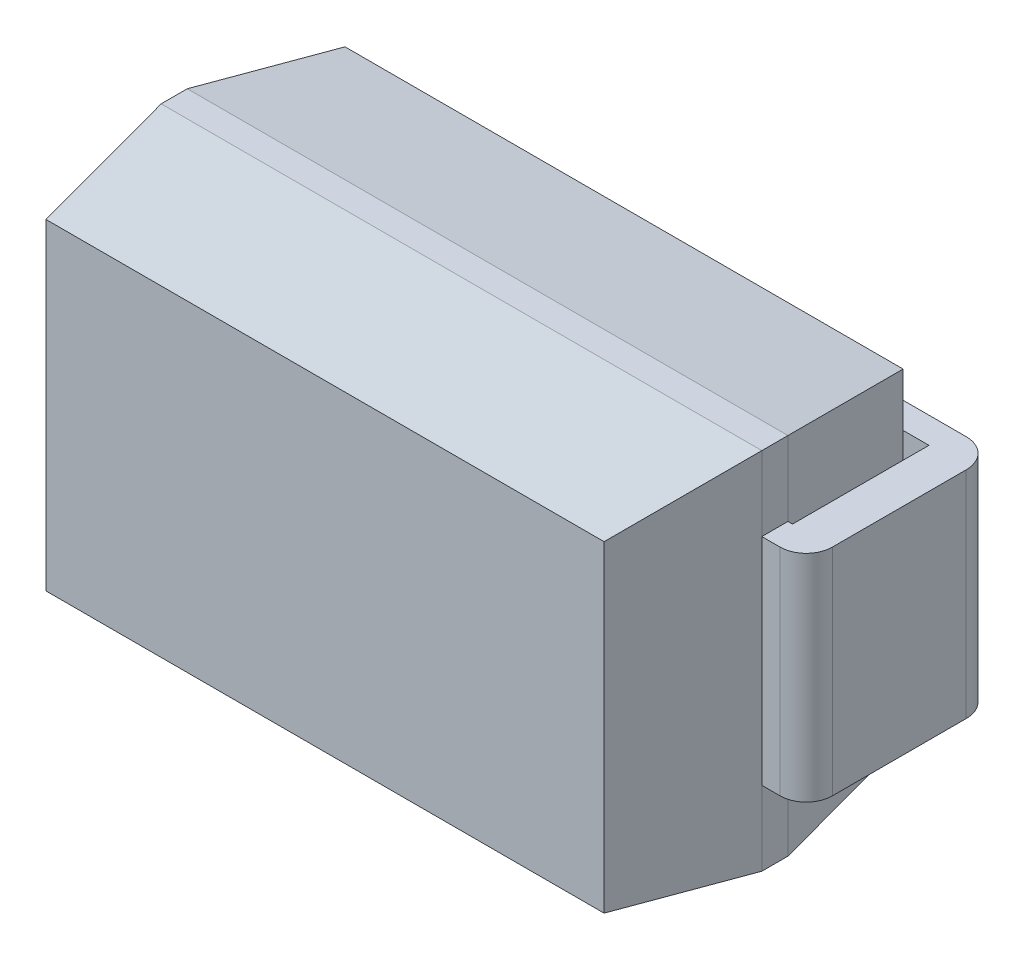
ISO-10303-21;
HEADER;
FILE_DESCRIPTION(('STEP AP214'),'2;1');
FILE_NAME('part.step','',(''),(''),'','','');
FILE_SCHEMA(('AUTOMOTIVE_DESIGN { 1 0 10303 214 1 1 1 1 }'));
ENDSEC;
DATA;
#1=APPLICATION_CONTEXT('core data for automotive mechanical design processes');
#2=APPLICATION_PROTOCOL_DEFINITION('international standard','automotive_design',2000,#1);
#3=PRODUCT_CONTEXT('',#1,'mechanical');
#4=PRODUCT('Part','Part','',(#3));
#5=PRODUCT_RELATED_PRODUCT_CATEGORY('part','',(#4));
#6=PRODUCT_DEFINITION_FORMATION('','',#4);
#7=PRODUCT_DEFINITION_CONTEXT('part definition',#1,'design');
#8=PRODUCT_DEFINITION('design','',#6,#7);
#9=PRODUCT_DEFINITION_SHAPE('','',#8);
#10=(LENGTH_UNIT() NAMED_UNIT(*) SI_UNIT(.MILLI.,.METRE.));
#11=(NAMED_UNIT(*) PLANE_ANGLE_UNIT() SI_UNIT($,.RADIAN.));
#12=(NAMED_UNIT(*) SI_UNIT($,.STERADIAN.) SOLID_ANGLE_UNIT());
#13=UNCERTAINTY_MEASURE_WITH_UNIT(LENGTH_MEASURE(1.E-05),#10,'distance_accuracy_value','');
#14=(GEOMETRIC_REPRESENTATION_CONTEXT(3) GLOBAL_UNCERTAINTY_ASSIGNED_CONTEXT((#13)) GLOBAL_UNIT_ASSIGNED_CONTEXT((#10,
#11,#12)) REPRESENTATION_CONTEXT('',''));
#15=CARTESIAN_POINT('',(0.,0.,0.));
#16=DIRECTION('',(0.,0.,1.));
#17=DIRECTION('',(1.,0.,0.));
#18=AXIS2_PLACEMENT_3D('',#15,#16,#17);
#19=CARTESIAN_POINT('',(2.3,-0.825,1.44500000000002));
#20=DIRECTION('',(0.,0.,1.));
#21=DIRECTION('',(-1.,0.,0.));
#22=AXIS2_PLACEMENT_3D('',#19,#20,#21);
#23=PLANE('',#22);
#24=DIRECTION('',(0.,1.,0.));
#25=VECTOR('',#24,1.);
#26=CARTESIAN_POINT('',(2.3,-0.825,1.44500000000002));
#27=LINE('',#26,#25);
#28=CARTESIAN_POINT('',(2.3,-0.825,1.44500000000002));
#29=VERTEX_POINT('',#28);
#30=CARTESIAN_POINT('',(2.3,0.825,1.44500000000002));
#31=VERTEX_POINT('',#30);
#32=EDGE_CURVE('E53',#29,#31,#27,.T.);
#33=ORIENTED_EDGE('',*,*,#32,.F.);
#34=DIRECTION('',(-1.,0.,0.));
#35=VECTOR('',#34,1.);
#36=CARTESIAN_POINT('',(2.3,-0.825,1.44500000000002));
#37=LINE('',#36,#35);
#38=CARTESIAN_POINT('',(2.44,-0.825,1.44500000000002));
#39=VERTEX_POINT('',#38);
#40=EDGE_CURVE('E199',#39,#29,#37,.T.);
#41=ORIENTED_EDGE('',*,*,#40,.F.);
#42=DIRECTION('',(0.,1.,0.));
#43=VECTOR('',#42,1.);
#44=CARTESIAN_POINT('',(2.44,-0.825,1.44500000000002));
#45=LINE('',#44,#43);
#46=CARTESIAN_POINT('',(2.44,0.825,1.44500000000002));
#47=VERTEX_POINT('',#46);
#48=EDGE_CURVE('E12',#39,#47,#45,.T.);
#49=ORIENTED_EDGE('',*,*,#48,.T.);
#50=DIRECTION('',(-1.,0.,0.));
#51=VECTOR('',#50,1.);
#52=CARTESIAN_POINT('',(2.3,0.825,1.44500000000002));
#53=LINE('',#52,#51);
#54=EDGE_CURVE('E132',#47,#31,#53,.T.);
#55=ORIENTED_EDGE('',*,*,#54,.T.);
#56=EDGE_LOOP('',(#33,#41,#49,#55));
#57=FACE_BOUND('',#56,.T.);
#58=ADVANCED_FACE('F50',(#57),#23,.T.);
#59=CARTESIAN_POINT('',(2.44,-0.825,1.24500000000002));
#60=DIRECTION('',(0.,1.,0.));
#61=DIRECTION('',(0.,0.,1.));
#62=AXIS2_PLACEMENT_3D('',#59,#60,#61);
#63=CYLINDRICAL_SURFACE('',#62,0.2);
#64=ORIENTED_EDGE('',*,*,#48,.F.);
#65=CARTESIAN_POINT('',(2.44,-0.825,1.24500000000002));
#66=DIRECTION('',(0.,-1.,0.));
#67=DIRECTION('',(0.,0.,-1.));
#68=AXIS2_PLACEMENT_3D('',#65,#66,#67);
#69=CIRCLE('',#68,0.2);
#70=CARTESIAN_POINT('',(2.64,-0.825,1.24500000000002));
#71=VERTEX_POINT('',#70);
#72=EDGE_CURVE('E66',#71,#39,#69,.T.);
#73=ORIENTED_EDGE('',*,*,#72,.F.);
#74=DIRECTION('',(0.,1.,0.));
#75=VECTOR('',#74,1.);
#76=CARTESIAN_POINT('',(2.64,-0.825,1.24500000000002));
#77=LINE('',#76,#75);
#78=CARTESIAN_POINT('',(2.64,0.825,1.24500000000002));
#79=VERTEX_POINT('',#78);
#80=EDGE_CURVE('E58',#71,#79,#77,.T.);
#81=ORIENTED_EDGE('',*,*,#80,.T.);
#82=CARTESIAN_POINT('',(2.44,0.825,1.24500000000002));
#83=DIRECTION('',(0.,-1.,0.));
#84=DIRECTION('',(0.,0.,-1.));
#85=AXIS2_PLACEMENT_3D('',#82,#83,#84);
#86=CIRCLE('',#85,0.2);
#87=EDGE_CURVE('E197',#79,#47,#86,.T.);
#88=ORIENTED_EDGE('',*,*,#87,.T.);
#89=EDGE_LOOP('',(#64,#73,#81,#88));
#90=FACE_BOUND('',#89,.T.);
#91=ADVANCED_FACE('F221',(#90),#63,.T.);
#92=CARTESIAN_POINT('',(2.64,-0.825,1.24500000000002));
#93=DIRECTION('',(1.,0.,0.));
#94=DIRECTION('',(0.,0.,1.));
#95=AXIS2_PLACEMENT_3D('',#92,#93,#94);
#96=PLANE('',#95);
#97=ORIENTED_EDGE('',*,*,#80,.F.);
#98=DIRECTION('',(0.,0.,1.));
#99=VECTOR('',#98,1.);
#100=CARTESIAN_POINT('',(2.64,-0.825,1.24500000000002));
#101=LINE('',#100,#99);
#102=CARTESIAN_POINT('',(2.64,-0.825,0.22));
#103=VERTEX_POINT('',#102);
#104=EDGE_CURVE('E71',#103,#71,#101,.T.);
#105=ORIENTED_EDGE('',*,*,#104,.F.);
#106=DIRECTION('',(0.,1.,0.));
#107=VECTOR('',#106,1.);
#108=CARTESIAN_POINT('',(2.64,-0.825,0.22));
#109=LINE('',#108,#107);
#110=CARTESIAN_POINT('',(2.64,0.825,0.22));
#111=VERTEX_POINT('',#110);
#112=EDGE_CURVE('E155',#103,#111,#109,.T.);
#113=ORIENTED_EDGE('',*,*,#112,.T.);
#114=DIRECTION('',(0.,0.,1.));
#115=VECTOR('',#114,1.);
#116=CARTESIAN_POINT('',(2.64,0.825,1.24500000000002));
#117=LINE('',#116,#115);
#118=EDGE_CURVE('E195',#111,#79,#117,.T.);
#119=ORIENTED_EDGE('',*,*,#118,.T.);
#120=EDGE_LOOP('',(#97,#105,#113,#119));
#121=FACE_BOUND('',#120,.T.);
#122=ADVANCED_FACE('F219',(#121),#96,.T.);
#123=CARTESIAN_POINT('',(2.42,-0.825,0.22));
#124=DIRECTION('',(0.,1.,0.));
#125=DIRECTION('',(0.,0.,1.));
#126=AXIS2_PLACEMENT_3D('',#123,#124,#125);
#127=CYLINDRICAL_SURFACE('',#126,0.22);
#128=ORIENTED_EDGE('',*,*,#112,.F.);
#129=CARTESIAN_POINT('',(2.42,-0.825,0.22));
#130=DIRECTION('',(0.,-1.,0.));
#131=DIRECTION('',(0.,0.,1.));
#132=AXIS2_PLACEMENT_3D('',#129,#130,#131);
#133=CIRCLE('',#132,0.22);
#134=CARTESIAN_POINT('',(2.42,-0.825,0.));
#135=VERTEX_POINT('',#134);
#136=EDGE_CURVE('E149',#135,#103,#133,.T.);
#137=ORIENTED_EDGE('',*,*,#136,.F.);
#138=DIRECTION('',(0.,1.,0.));
#139=VECTOR('',#138,1.);
#140=CARTESIAN_POINT('',(2.42,-0.825,0.));
#141=LINE('',#140,#139);
#142=CARTESIAN_POINT('',(2.42,0.825,0.));
#143=VERTEX_POINT('',#142);
#144=EDGE_CURVE('E158',#135,#143,#141,.T.);
#145=ORIENTED_EDGE('',*,*,#144,.T.);
#146=CARTESIAN_POINT('',(2.42,0.825,0.22));
#147=DIRECTION('',(0.,-1.,0.));
#148=DIRECTION('',(0.,0.,1.));
#149=AXIS2_PLACEMENT_3D('',#146,#147,#148);
#150=CIRCLE('',#149,0.22);
#151=EDGE_CURVE('E193',#143,#111,#150,.T.);
#152=ORIENTED_EDGE('',*,*,#151,.T.);
#153=EDGE_LOOP('',(#128,#137,#145,#152));
#154=FACE_BOUND('',#153,.T.);
#155=ADVANCED_FACE('F215',(#154),#127,.T.);
#156=CARTESIAN_POINT('',(1.12,-0.825,0.));
#157=DIRECTION('',(0.,0.,-1.));
#158=DIRECTION('',(1.,0.,0.));
#159=AXIS2_PLACEMENT_3D('',#156,#157,#158);
#160=PLANE('',#159);
#161=ORIENTED_EDGE('',*,*,#144,.F.);
#162=DIRECTION('',(1.,0.,0.));
#163=VECTOR('',#162,1.);
#164=CARTESIAN_POINT('',(1.12,-0.825,0.));
#165=LINE('',#164,#163);
#166=CARTESIAN_POINT('',(1.12,-0.825,0.));
#167=VERTEX_POINT('',#166);
#168=EDGE_CURVE('E208',#167,#135,#165,.T.);
#169=ORIENTED_EDGE('',*,*,#168,.F.);
#170=DIRECTION('',(0.,1.,0.));
#171=VECTOR('',#170,1.);
#172=CARTESIAN_POINT('',(1.12,-0.825,0.));
#173=LINE('',#172,#171);
#174=CARTESIAN_POINT('',(1.12,0.825,0.));
#175=VERTEX_POINT('',#174);
#176=EDGE_CURVE('E161',#167,#175,#173,.T.);
#177=ORIENTED_EDGE('',*,*,#176,.T.);
#178=DIRECTION('',(1.,0.,0.));
#179=VECTOR('',#178,1.);
#180=CARTESIAN_POINT('',(1.12,0.825,0.));
#181=LINE('',#180,#179);
#182=EDGE_CURVE('E191',#175,#143,#181,.T.);
#183=ORIENTED_EDGE('',*,*,#182,.T.);
#184=EDGE_LOOP('',(#161,#169,#177,#183));
#185=FACE_BOUND('',#184,.T.);
#186=ADVANCED_FACE('F232',(#185),#160,.T.);
#187=CARTESIAN_POINT('',(1.12,-0.825,0.));
#188=DIRECTION('',(-1.,0.,0.));
#189=DIRECTION('',(0.,0.,-1.));
#190=AXIS2_PLACEMENT_3D('',#187,#188,#189);
#191=PLANE('',#190);
#192=ORIENTED_EDGE('',*,*,#176,.F.);
#193=DIRECTION('',(0.,0.,-1.));
#194=VECTOR('',#193,1.);
#195=CARTESIAN_POINT('',(1.12,-0.825,0.));
#196=LINE('',#195,#194);
#197=CARTESIAN_POINT('',(1.12,-0.825,0.2));
#198=VERTEX_POINT('',#197);
#199=EDGE_CURVE('E206',#198,#167,#196,.T.);
#200=ORIENTED_EDGE('',*,*,#199,.F.);
#201=DIRECTION('',(0.,1.,0.));
#202=VECTOR('',#201,1.);
#203=CARTESIAN_POINT('',(1.12,-0.825,0.2));
#204=LINE('',#203,#202);
#205=CARTESIAN_POINT('',(1.12,0.825,0.2));
#206=VERTEX_POINT('',#205);
#207=EDGE_CURVE('E164',#198,#206,#204,.T.);
#208=ORIENTED_EDGE('',*,*,#207,.T.);
#209=DIRECTION('',(0.,0.,-1.));
#210=VECTOR('',#209,1.);
#211=CARTESIAN_POINT('',(1.12,0.825,0.));
#212=LINE('',#211,#210);
#213=EDGE_CURVE('E187',#206,#175,#212,.T.);
#214=ORIENTED_EDGE('',*,*,#213,.T.);
#215=EDGE_LOOP('',(#192,#200,#208,#214));
#216=FACE_BOUND('',#215,.T.);
#217=ADVANCED_FACE('F229',(#216),#191,.T.);
#218=CARTESIAN_POINT('',(1.12,-0.825,0.2));
#219=DIRECTION('',(0.,0.,1.));
#220=DIRECTION('',(-1.,0.,0.));
#221=AXIS2_PLACEMENT_3D('',#218,#219,#220);
#222=PLANE('',#221);
#223=ORIENTED_EDGE('',*,*,#207,.F.);
#224=DIRECTION('',(-1.,0.,0.));
#225=VECTOR('',#224,1.);
#226=CARTESIAN_POINT('',(1.12,-0.825,0.2));
#227=LINE('',#226,#225);
#228=CARTESIAN_POINT('',(2.335,-0.825,0.2));
#229=VERTEX_POINT('',#228);
#230=EDGE_CURVE('E204',#229,#198,#227,.T.);
#231=ORIENTED_EDGE('',*,*,#230,.F.);
#232=DIRECTION('',(0.,1.,0.));
#233=VECTOR('',#232,1.);
#234=CARTESIAN_POINT('',(2.335,-0.825,0.2));
#235=LINE('',#234,#233);
#236=CARTESIAN_POINT('',(2.335,0.825,0.2));
#237=VERTEX_POINT('',#236);
#238=EDGE_CURVE('E167',#229,#237,#235,.T.);
#239=ORIENTED_EDGE('',*,*,#238,.T.);
#240=DIRECTION('',(-1.,0.,0.));
#241=VECTOR('',#240,1.);
#242=CARTESIAN_POINT('',(1.12,0.825,0.2));
#243=LINE('',#242,#241);
#244=EDGE_CURVE('E185',#237,#206,#243,.T.);
#245=ORIENTED_EDGE('',*,*,#244,.T.);
#246=EDGE_LOOP('',(#223,#231,#239,#245));
#247=FACE_BOUND('',#246,.T.);
#248=ADVANCED_FACE('F225',(#247),#222,.T.);
#249=CARTESIAN_POINT('',(2.335,-0.825,0.2));
#250=DIRECTION('',(-1.,0.,0.));
#251=DIRECTION('',(0.,0.,-1.));
#252=AXIS2_PLACEMENT_3D('',#249,#250,#251);
#253=PLANE('',#252);
#254=ORIENTED_EDGE('',*,*,#238,.F.);
#255=DIRECTION('',(0.,0.,-1.));
#256=VECTOR('',#255,1.);
#257=CARTESIAN_POINT('',(2.335,-0.825,0.2));
#258=LINE('',#257,#256);
#259=CARTESIAN_POINT('',(2.335,-0.825,1.24500000000002));
#260=VERTEX_POINT('',#259);
#261=EDGE_CURVE('E178',#260,#229,#258,.T.);
#262=ORIENTED_EDGE('',*,*,#261,.F.);
#263=DIRECTION('',(0.,1.,0.));
#264=VECTOR('',#263,1.);
#265=CARTESIAN_POINT('',(2.335,-0.825,1.24500000000002));
#266=LINE('',#265,#264);
#267=CARTESIAN_POINT('',(2.335,0.825,1.24500000000002));
#268=VERTEX_POINT('',#267);
#269=EDGE_CURVE('E147',#260,#268,#266,.T.);
#270=ORIENTED_EDGE('',*,*,#269,.T.);
#271=DIRECTION('',(0.,0.,-1.));
#272=VECTOR('',#271,1.);
#273=CARTESIAN_POINT('',(2.335,0.825,0.2));
#274=LINE('',#273,#272);
#275=EDGE_CURVE('E176',#268,#237,#274,.T.);
#276=ORIENTED_EDGE('',*,*,#275,.T.);
#277=EDGE_LOOP('',(#254,#262,#270,#276));
#278=FACE_BOUND('',#277,.T.);
#279=ADVANCED_FACE('F175',(#278),#253,.T.);
#280=CARTESIAN_POINT('',(2.335,-0.825,1.24500000000002));
#281=DIRECTION('',(0.,0.,-1.));
#282=DIRECTION('',(1.,0.,0.));
#283=AXIS2_PLACEMENT_3D('',#280,#281,#282);
#284=PLANE('',#283);
#285=ORIENTED_EDGE('',*,*,#269,.F.);
#286=DIRECTION('',(1.,0.,0.));
#287=VECTOR('',#286,1.);
#288=CARTESIAN_POINT('',(2.335,-0.825,1.24500000000002));
#289=LINE('',#288,#287);
#290=CARTESIAN_POINT('',(2.3,-0.825,1.24500000000002));
#291=VERTEX_POINT('',#290);
#292=EDGE_CURVE('E182',#291,#260,#289,.T.);
#293=ORIENTED_EDGE('',*,*,#292,.F.);
#294=DIRECTION('',(0.,1.,0.));
#295=VECTOR('',#294,1.);
#296=CARTESIAN_POINT('',(2.3,-0.825,1.24500000000002));
#297=LINE('',#296,#295);
#298=CARTESIAN_POINT('',(2.3,0.825,1.24500000000002));
#299=VERTEX_POINT('',#298);
#300=EDGE_CURVE('E146',#291,#299,#297,.T.);
#301=ORIENTED_EDGE('',*,*,#300,.T.);
#302=DIRECTION('',(1.,0.,0.));
#303=VECTOR('',#302,1.);
#304=CARTESIAN_POINT('',(2.335,0.825,1.24500000000002));
#305=LINE('',#304,#303);
#306=EDGE_CURVE('E134',#299,#268,#305,.T.);
#307=ORIENTED_EDGE('',*,*,#306,.T.);
#308=EDGE_LOOP('',(#285,#293,#301,#307));
#309=FACE_BOUND('',#308,.T.);
#310=ADVANCED_FACE('F181',(#309),#284,.T.);
#311=CARTESIAN_POINT('',(2.3,-0.825,1.24500000000002));
#312=DIRECTION('',(-1.,0.,0.));
#313=DIRECTION('',(0.,0.,-1.));
#314=AXIS2_PLACEMENT_3D('',#311,#312,#313);
#315=PLANE('',#314);
#316=ORIENTED_EDGE('',*,*,#300,.F.);
#317=DIRECTION('',(0.,0.,-1.));
#318=VECTOR('',#317,1.);
#319=CARTESIAN_POINT('',(2.3,-0.825,1.24500000000002));
#320=LINE('',#319,#318);
#321=EDGE_CURVE('E145',#29,#291,#320,.T.);
#322=ORIENTED_EDGE('',*,*,#321,.F.);
#323=ORIENTED_EDGE('',*,*,#32,.T.);
#324=DIRECTION('',(0.,0.,-1.));
#325=VECTOR('',#324,1.);
#326=CARTESIAN_POINT('',(2.3,0.825,1.24500000000002));
#327=LINE('',#326,#325);
#328=EDGE_CURVE('E128',#31,#299,#327,.T.);
#329=ORIENTED_EDGE('',*,*,#328,.T.);
#330=EDGE_LOOP('',(#316,#322,#323,#329));
#331=FACE_BOUND('',#330,.T.);
#332=ADVANCED_FACE('F144',(#331),#315,.T.);
#333=CARTESIAN_POINT('',(2.44,-0.825,1.24500000000002));
#334=DIRECTION('',(0.,-1.,0.));
#335=DIRECTION('',(0.,0.,-1.));
#336=AXIS2_PLACEMENT_3D('',#333,#334,#335);
#337=PLANE('',#336);
#338=ORIENTED_EDGE('',*,*,#40,.T.);
#339=ORIENTED_EDGE('',*,*,#321,.T.);
#340=ORIENTED_EDGE('',*,*,#292,.T.);
#341=ORIENTED_EDGE('',*,*,#261,.T.);
#342=ORIENTED_EDGE('',*,*,#230,.T.);
#343=ORIENTED_EDGE('',*,*,#199,.T.);
#344=ORIENTED_EDGE('',*,*,#168,.T.);
#345=ORIENTED_EDGE('',*,*,#136,.T.);
#346=ORIENTED_EDGE('',*,*,#104,.T.);
#347=ORIENTED_EDGE('',*,*,#72,.T.);
#348=EDGE_LOOP('',(#338,#339,#340,#341,#342,#343,#344,#345,#346,#347));
#349=FACE_BOUND('',#348,.T.);
#350=ADVANCED_FACE('F211',(#349),#337,.T.);
#351=CARTESIAN_POINT('',(2.44,0.825,1.24500000000002));
#352=DIRECTION('',(0.,-1.,0.));
#353=DIRECTION('',(0.,0.,-1.));
#354=AXIS2_PLACEMENT_3D('',#351,#352,#353);
#355=PLANE('',#354);
#356=ORIENTED_EDGE('',*,*,#54,.F.);
#357=ORIENTED_EDGE('',*,*,#87,.F.);
#358=ORIENTED_EDGE('',*,*,#118,.F.);
#359=ORIENTED_EDGE('',*,*,#151,.F.);
#360=ORIENTED_EDGE('',*,*,#182,.F.);
#361=ORIENTED_EDGE('',*,*,#213,.F.);
#362=ORIENTED_EDGE('',*,*,#244,.F.);
#363=ORIENTED_EDGE('',*,*,#275,.F.);
#364=ORIENTED_EDGE('',*,*,#306,.F.);
#365=ORIENTED_EDGE('',*,*,#328,.F.);
#366=EDGE_LOOP('',(#356,#357,#358,#359,#360,#361,#362,#363,#364,#365));
#367=FACE_BOUND('',#366,.T.);
#368=ADVANCED_FACE('F130',(#367),#355,.F.);
#369=CLOSED_SHELL('',(#58,#91,#122,#155,#186,#217,#248,#279,#310,#332,#350,#368));
#370=MANIFOLD_SOLID_BREP('B2',#369);
#371=CARTESIAN_POINT('',(-2.3,-0.825,1.44500000000002));
#372=DIRECTION('',(0.,0.,1.));
#373=DIRECTION('',(1.,0.,0.));
#374=AXIS2_PLACEMENT_3D('',#371,#372,#373);
#375=PLANE('',#374);
#376=DIRECTION('',(0.,1.,0.));
#377=VECTOR('',#376,1.);
#378=CARTESIAN_POINT('',(-2.3,-0.825,1.44500000000002));
#379=LINE('',#378,#377);
#380=CARTESIAN_POINT('',(-2.3,-0.825,1.44500000000002));
#381=VERTEX_POINT('',#380);
#382=CARTESIAN_POINT('',(-2.3,0.825,1.44500000000002));
#383=VERTEX_POINT('',#382);
#384=EDGE_CURVE('E366',#381,#383,#379,.T.);
#385=ORIENTED_EDGE('',*,*,#384,.T.);
#386=DIRECTION('',(1.,0.,0.));
#387=VECTOR('',#386,1.);
#388=CARTESIAN_POINT('',(-2.3,0.825,1.44500000000002));
#389=LINE('',#388,#387);
#390=CARTESIAN_POINT('',(-2.44,0.825,1.44500000000002));
#391=VERTEX_POINT('',#390);
#392=EDGE_CURVE('E439',#391,#383,#389,.T.);
#393=ORIENTED_EDGE('',*,*,#392,.F.);
#394=DIRECTION('',(0.,1.,0.));
#395=VECTOR('',#394,1.);
#396=CARTESIAN_POINT('',(-2.44,-0.825,1.44500000000002));
#397=LINE('',#396,#395);
#398=CARTESIAN_POINT('',(-2.44,-0.825,1.44500000000002));
#399=VERTEX_POINT('',#398);
#400=EDGE_CURVE('E48',#399,#391,#397,.T.);
#401=ORIENTED_EDGE('',*,*,#400,.F.);
#402=DIRECTION('',(1.,0.,0.));
#403=VECTOR('',#402,1.);
#404=CARTESIAN_POINT('',(-2.3,-0.825,1.44500000000002));
#405=LINE('',#404,#403);
#406=EDGE_CURVE('E440',#399,#381,#405,.T.);
#407=ORIENTED_EDGE('',*,*,#406,.T.);
#408=EDGE_LOOP('',(#385,#393,#401,#407));
#409=FACE_BOUND('',#408,.T.);
#410=ADVANCED_FACE('F363',(#409),#375,.T.);
#411=CARTESIAN_POINT('',(-2.44,-0.825,1.24500000000002));
#412=DIRECTION('',(0.,1.,0.));
#413=DIRECTION('',(0.,0.,1.));
#414=AXIS2_PLACEMENT_3D('',#411,#412,#413);
#415=CYLINDRICAL_SURFACE('',#414,0.2);
#416=ORIENTED_EDGE('',*,*,#400,.T.);
#417=CARTESIAN_POINT('',(-2.44,0.825,1.24500000000002));
#418=DIRECTION('',(0.,1.,0.));
#419=DIRECTION('',(0.,0.,-1.));
#420=AXIS2_PLACEMENT_3D('',#417,#418,#419);
#421=CIRCLE('',#420,0.2);
#422=CARTESIAN_POINT('',(-2.64,0.825,1.24500000000002));
#423=VERTEX_POINT('',#422);
#424=EDGE_CURVE('E457',#423,#391,#421,.T.);
#425=ORIENTED_EDGE('',*,*,#424,.F.);
#426=DIRECTION('',(0.,1.,0.));
#427=VECTOR('',#426,1.);
#428=CARTESIAN_POINT('',(-2.64,-0.825,1.24500000000002));
#429=LINE('',#428,#427);
#430=CARTESIAN_POINT('',(-2.64,-0.825,1.24500000000002));
#431=VERTEX_POINT('',#430);
#432=EDGE_CURVE('E371',#431,#423,#429,.T.);
#433=ORIENTED_EDGE('',*,*,#432,.F.);
#434=CARTESIAN_POINT('',(-2.44,-0.825,1.24500000000002));
#435=DIRECTION('',(0.,1.,0.));
#436=DIRECTION('',(0.,0.,-1.));
#437=AXIS2_PLACEMENT_3D('',#434,#435,#436);
#438=CIRCLE('',#437,0.2);
#439=EDGE_CURVE('E445',#431,#399,#438,.T.);
#440=ORIENTED_EDGE('',*,*,#439,.T.);
#441=EDGE_LOOP('',(#416,#425,#433,#440));
#442=FACE_BOUND('',#441,.T.);
#443=ADVANCED_FACE('F545',(#442),#415,.T.);
#444=CARTESIAN_POINT('',(-2.64,-0.825,1.24500000000002));
#445=DIRECTION('',(-1.,0.,0.));
#446=DIRECTION('',(0.,0.,1.));
#447=AXIS2_PLACEMENT_3D('',#444,#445,#446);
#448=PLANE('',#447);
#449=ORIENTED_EDGE('',*,*,#432,.T.);
#450=DIRECTION('',(0.,0.,1.));
#451=VECTOR('',#450,1.);
#452=CARTESIAN_POINT('',(-2.64,0.825,1.24500000000002));
#453=LINE('',#452,#451);
#454=CARTESIAN_POINT('',(-2.64,0.825,0.22));
#455=VERTEX_POINT('',#454);
#456=EDGE_CURVE('E476',#455,#423,#453,.T.);
#457=ORIENTED_EDGE('',*,*,#456,.F.);
#458=DIRECTION('',(0.,1.,0.));
#459=VECTOR('',#458,1.);
#460=CARTESIAN_POINT('',(-2.64,-0.825,0.22));
#461=LINE('',#460,#459);
#462=CARTESIAN_POINT('',(-2.64,-0.825,0.22));
#463=VERTEX_POINT('',#462);
#464=EDGE_CURVE('E504',#463,#455,#461,.T.);
#465=ORIENTED_EDGE('',*,*,#464,.F.);
#466=DIRECTION('',(0.,0.,1.));
#467=VECTOR('',#466,1.);
#468=CARTESIAN_POINT('',(-2.64,-0.825,1.24500000000002));
#469=LINE('',#468,#467);
#470=EDGE_CURVE('E500',#463,#431,#469,.T.);
#471=ORIENTED_EDGE('',*,*,#470,.T.);
#472=EDGE_LOOP('',(#449,#457,#465,#471));
#473=FACE_BOUND('',#472,.T.);
#474=ADVANCED_FACE('F543',(#473),#448,.T.);
#475=CARTESIAN_POINT('',(-2.42,-0.825,0.22));
#476=DIRECTION('',(0.,1.,0.));
#477=DIRECTION('',(0.,0.,1.));
#478=AXIS2_PLACEMENT_3D('',#475,#476,#477);
#479=CYLINDRICAL_SURFACE('',#478,0.22);
#480=ORIENTED_EDGE('',*,*,#464,.T.);
#481=CARTESIAN_POINT('',(-2.42,0.825,0.22));
#482=DIRECTION('',(0.,1.,0.));
#483=DIRECTION('',(0.,0.,1.));
#484=AXIS2_PLACEMENT_3D('',#481,#482,#483);
#485=CIRCLE('',#484,0.22);
#486=CARTESIAN_POINT('',(-2.42,0.825,0.));
#487=VERTEX_POINT('',#486);
#488=EDGE_CURVE('E473',#487,#455,#485,.T.);
#489=ORIENTED_EDGE('',*,*,#488,.F.);
#490=DIRECTION('',(0.,1.,0.));
#491=VECTOR('',#490,1.);
#492=CARTESIAN_POINT('',(-2.42,-0.825,0.));
#493=LINE('',#492,#491);
#494=CARTESIAN_POINT('',(-2.42,-0.825,0.));
#495=VERTEX_POINT('',#494);
#496=EDGE_CURVE('E506',#495,#487,#493,.T.);
#497=ORIENTED_EDGE('',*,*,#496,.F.);
#498=CARTESIAN_POINT('',(-2.42,-0.825,0.22));
#499=DIRECTION('',(0.,1.,0.));
#500=DIRECTION('',(0.,0.,1.));
#501=AXIS2_PLACEMENT_3D('',#498,#499,#500);
#502=CIRCLE('',#501,0.22);
#503=EDGE_CURVE('E497',#495,#463,#502,.T.);
#504=ORIENTED_EDGE('',*,*,#503,.T.);
#505=EDGE_LOOP('',(#480,#489,#497,#504));
#506=FACE_BOUND('',#505,.T.);
#507=ADVANCED_FACE('F539',(#506),#479,.T.);
#508=CARTESIAN_POINT('',(-1.12,-0.825,0.));
#509=DIRECTION('',(0.,0.,-1.));
#510=DIRECTION('',(-1.,0.,0.));
#511=AXIS2_PLACEMENT_3D('',#508,#509,#510);
#512=PLANE('',#511);
#513=ORIENTED_EDGE('',*,*,#496,.T.);
#514=DIRECTION('',(-1.,0.,0.));
#515=VECTOR('',#514,1.);
#516=CARTESIAN_POINT('',(-1.12,0.825,0.));
#517=LINE('',#516,#515);
#518=CARTESIAN_POINT('',(-1.12,0.825,0.));
#519=VERTEX_POINT('',#518);
#520=EDGE_CURVE('E470',#519,#487,#517,.T.);
#521=ORIENTED_EDGE('',*,*,#520,.F.);
#522=DIRECTION('',(0.,1.,0.));
#523=VECTOR('',#522,1.);
#524=CARTESIAN_POINT('',(-1.12,-0.825,0.));
#525=LINE('',#524,#523);
#526=CARTESIAN_POINT('',(-1.12,-0.825,0.));
#527=VERTEX_POINT('',#526);
#528=EDGE_CURVE('E508',#527,#519,#525,.T.);
#529=ORIENTED_EDGE('',*,*,#528,.F.);
#530=DIRECTION('',(-1.,0.,0.));
#531=VECTOR('',#530,1.);
#532=CARTESIAN_POINT('',(-1.12,-0.825,0.));
#533=LINE('',#532,#531);
#534=EDGE_CURVE('E494',#527,#495,#533,.T.);
#535=ORIENTED_EDGE('',*,*,#534,.T.);
#536=EDGE_LOOP('',(#513,#521,#529,#535));
#537=FACE_BOUND('',#536,.T.);
#538=ADVANCED_FACE('F537',(#537),#512,.T.);
#539=CARTESIAN_POINT('',(-1.12,-0.825,0.));
#540=DIRECTION('',(1.,0.,0.));
#541=DIRECTION('',(0.,0.,-1.));
#542=AXIS2_PLACEMENT_3D('',#539,#540,#541);
#543=PLANE('',#542);
#544=ORIENTED_EDGE('',*,*,#528,.T.);
#545=DIRECTION('',(0.,0.,-1.));
#546=VECTOR('',#545,1.);
#547=CARTESIAN_POINT('',(-1.12,0.825,0.));
#548=LINE('',#547,#546);
#549=CARTESIAN_POINT('',(-1.12,0.825,0.2));
#550=VERTEX_POINT('',#549);
#551=EDGE_CURVE('E467',#550,#519,#548,.T.);
#552=ORIENTED_EDGE('',*,*,#551,.F.);
#553=DIRECTION('',(0.,1.,0.));
#554=VECTOR('',#553,1.);
#555=CARTESIAN_POINT('',(-1.12,-0.825,0.2));
#556=LINE('',#555,#554);
#557=CARTESIAN_POINT('',(-1.12,-0.825,0.2));
#558=VERTEX_POINT('',#557);
#559=EDGE_CURVE('E510',#558,#550,#556,.T.);
#560=ORIENTED_EDGE('',*,*,#559,.F.);
#561=DIRECTION('',(0.,0.,-1.));
#562=VECTOR('',#561,1.);
#563=CARTESIAN_POINT('',(-1.12,-0.825,0.));
#564=LINE('',#563,#562);
#565=EDGE_CURVE('E491',#558,#527,#564,.T.);
#566=ORIENTED_EDGE('',*,*,#565,.T.);
#567=EDGE_LOOP('',(#544,#552,#560,#566));
#568=FACE_BOUND('',#567,.T.);
#569=ADVANCED_FACE('F532',(#568),#543,.T.);
#570=CARTESIAN_POINT('',(-1.12,-0.825,0.2));
#571=DIRECTION('',(0.,0.,1.));
#572=DIRECTION('',(1.,0.,0.));
#573=AXIS2_PLACEMENT_3D('',#570,#571,#572);
#574=PLANE('',#573);
#575=ORIENTED_EDGE('',*,*,#559,.T.);
#576=DIRECTION('',(1.,0.,0.));
#577=VECTOR('',#576,1.);
#578=CARTESIAN_POINT('',(-1.12,0.825,0.2));
#579=LINE('',#578,#577);
#580=CARTESIAN_POINT('',(-2.335,0.825,0.2));
#581=VERTEX_POINT('',#580);
#582=EDGE_CURVE('E464',#581,#550,#579,.T.);
#583=ORIENTED_EDGE('',*,*,#582,.F.);
#584=DIRECTION('',(0.,1.,0.));
#585=VECTOR('',#584,1.);
#586=CARTESIAN_POINT('',(-2.335,-0.825,0.2));
#587=LINE('',#586,#585);
#588=CARTESIAN_POINT('',(-2.335,-0.825,0.2));
#589=VERTEX_POINT('',#588);
#590=EDGE_CURVE('E512',#589,#581,#587,.T.);
#591=ORIENTED_EDGE('',*,*,#590,.F.);
#592=DIRECTION('',(1.,0.,0.));
#593=VECTOR('',#592,1.);
#594=CARTESIAN_POINT('',(-1.12,-0.825,0.2));
#595=LINE('',#594,#593);
#596=EDGE_CURVE('E488',#589,#558,#595,.T.);
#597=ORIENTED_EDGE('',*,*,#596,.T.);
#598=EDGE_LOOP('',(#575,#583,#591,#597));
#599=FACE_BOUND('',#598,.T.);
#600=ADVANCED_FACE('F525',(#599),#574,.T.);
#601=CARTESIAN_POINT('',(-2.335,-0.825,0.2));
#602=DIRECTION('',(1.,0.,0.));
#603=DIRECTION('',(0.,0.,-1.));
#604=AXIS2_PLACEMENT_3D('',#601,#602,#603);
#605=PLANE('',#604);
#606=ORIENTED_EDGE('',*,*,#590,.T.);
#607=DIRECTION('',(0.,0.,-1.));
#608=VECTOR('',#607,1.);
#609=CARTESIAN_POINT('',(-2.335,0.825,0.2));
#610=LINE('',#609,#608);
#611=CARTESIAN_POINT('',(-2.335,0.825,1.24500000000002));
#612=VERTEX_POINT('',#611);
#613=EDGE_CURVE('E461',#612,#581,#610,.T.);
#614=ORIENTED_EDGE('',*,*,#613,.F.);
#615=DIRECTION('',(0.,1.,0.));
#616=VECTOR('',#615,1.);
#617=CARTESIAN_POINT('',(-2.335,-0.825,1.24500000000002));
#618=LINE('',#617,#616);
#619=CARTESIAN_POINT('',(-2.335,-0.825,1.24500000000002));
#620=VERTEX_POINT('',#619);
#621=EDGE_CURVE('E514',#620,#612,#618,.T.);
#622=ORIENTED_EDGE('',*,*,#621,.F.);
#623=DIRECTION('',(0.,0.,-1.));
#624=VECTOR('',#623,1.);
#625=CARTESIAN_POINT('',(-2.335,-0.825,0.2));
#626=LINE('',#625,#624);
#627=EDGE_CURVE('E485',#620,#589,#626,.T.);
#628=ORIENTED_EDGE('',*,*,#627,.T.);
#629=EDGE_LOOP('',(#606,#614,#622,#628));
#630=FACE_BOUND('',#629,.T.);
#631=ADVANCED_FACE('F522',(#630),#605,.T.);
#632=CARTESIAN_POINT('',(-2.335,-0.825,1.24500000000002));
#633=DIRECTION('',(0.,0.,-1.));
#634=DIRECTION('',(-1.,0.,0.));
#635=AXIS2_PLACEMENT_3D('',#632,#633,#634);
#636=PLANE('',#635);
#637=ORIENTED_EDGE('',*,*,#621,.T.);
#638=DIRECTION('',(-1.,0.,0.));
#639=VECTOR('',#638,1.);
#640=CARTESIAN_POINT('',(-2.335,0.825,1.24500000000002));
#641=LINE('',#640,#639);
#642=CARTESIAN_POINT('',(-2.3,0.825,1.24500000000002));
#643=VERTEX_POINT('',#642);
#644=EDGE_CURVE('E452',#643,#612,#641,.T.);
#645=ORIENTED_EDGE('',*,*,#644,.F.);
#646=DIRECTION('',(0.,1.,0.));
#647=VECTOR('',#646,1.);
#648=CARTESIAN_POINT('',(-2.3,-0.825,1.24500000000002));
#649=LINE('',#648,#647);
#650=CARTESIAN_POINT('',(-2.3,-0.825,1.24500000000002));
#651=VERTEX_POINT('',#650);
#652=EDGE_CURVE('E444',#651,#643,#649,.T.);
#653=ORIENTED_EDGE('',*,*,#652,.F.);
#654=DIRECTION('',(-1.,0.,0.));
#655=VECTOR('',#654,1.);
#656=CARTESIAN_POINT('',(-2.335,-0.825,1.24500000000002));
#657=LINE('',#656,#655);
#658=EDGE_CURVE('E482',#651,#620,#657,.T.);
#659=ORIENTED_EDGE('',*,*,#658,.T.);
#660=EDGE_LOOP('',(#637,#645,#653,#659));
#661=FACE_BOUND('',#660,.T.);
#662=ADVANCED_FACE('F516',(#661),#636,.T.);
#663=CARTESIAN_POINT('',(-2.3,-0.825,1.24500000000002));
#664=DIRECTION('',(1.,0.,0.));
#665=DIRECTION('',(0.,0.,-1.));
#666=AXIS2_PLACEMENT_3D('',#663,#664,#665);
#667=PLANE('',#666);
#668=ORIENTED_EDGE('',*,*,#652,.T.);
#669=DIRECTION('',(0.,0.,-1.));
#670=VECTOR('',#669,1.);
#671=CARTESIAN_POINT('',(-2.3,0.825,1.24500000000002));
#672=LINE('',#671,#670);
#673=EDGE_CURVE('E447',#383,#643,#672,.T.);
#674=ORIENTED_EDGE('',*,*,#673,.F.);
#675=ORIENTED_EDGE('',*,*,#384,.F.);
#676=DIRECTION('',(0.,0.,-1.));
#677=VECTOR('',#676,1.);
#678=CARTESIAN_POINT('',(-2.3,-0.825,1.24500000000002));
#679=LINE('',#678,#677);
#680=EDGE_CURVE('E480',#381,#651,#679,.T.);
#681=ORIENTED_EDGE('',*,*,#680,.T.);
#682=EDGE_LOOP('',(#668,#674,#675,#681));
#683=FACE_BOUND('',#682,.T.);
#684=ADVANCED_FACE('F448',(#683),#667,.T.);
#685=CARTESIAN_POINT('',(-2.44,-0.825,1.24500000000002));
#686=DIRECTION('',(0.,-1.,0.));
#687=DIRECTION('',(0.,0.,-1.));
#688=AXIS2_PLACEMENT_3D('',#685,#686,#687);
#689=PLANE('',#688);
#690=ORIENTED_EDGE('',*,*,#406,.F.);
#691=ORIENTED_EDGE('',*,*,#439,.F.);
#692=ORIENTED_EDGE('',*,*,#470,.F.);
#693=ORIENTED_EDGE('',*,*,#503,.F.);
#694=ORIENTED_EDGE('',*,*,#534,.F.);
#695=ORIENTED_EDGE('',*,*,#565,.F.);
#696=ORIENTED_EDGE('',*,*,#596,.F.);
#697=ORIENTED_EDGE('',*,*,#627,.F.);
#698=ORIENTED_EDGE('',*,*,#658,.F.);
#699=ORIENTED_EDGE('',*,*,#680,.F.);
#700=EDGE_LOOP('',(#690,#691,#692,#693,#694,#695,#696,#697,#698,#699));
#701=FACE_BOUND('',#700,.T.);
#702=ADVANCED_FACE('F528',(#701),#689,.T.);
#703=CARTESIAN_POINT('',(-2.44,0.825,1.24500000000002));
#704=DIRECTION('',(0.,-1.,0.));
#705=DIRECTION('',(0.,0.,-1.));
#706=AXIS2_PLACEMENT_3D('',#703,#704,#705);
#707=PLANE('',#706);
#708=ORIENTED_EDGE('',*,*,#392,.T.);
#709=ORIENTED_EDGE('',*,*,#673,.T.);
#710=ORIENTED_EDGE('',*,*,#644,.T.);
#711=ORIENTED_EDGE('',*,*,#613,.T.);
#712=ORIENTED_EDGE('',*,*,#582,.T.);
#713=ORIENTED_EDGE('',*,*,#551,.T.);
#714=ORIENTED_EDGE('',*,*,#520,.T.);
#715=ORIENTED_EDGE('',*,*,#488,.T.);
#716=ORIENTED_EDGE('',*,*,#456,.T.);
#717=ORIENTED_EDGE('',*,*,#424,.T.);
#718=EDGE_LOOP('',(#708,#709,#710,#711,#712,#713,#714,#715,#716,#717));
#719=FACE_BOUND('',#718,.T.);
#720=ADVANCED_FACE('F455',(#719),#707,.F.);
#721=CLOSED_SHELL('',(#410,#443,#474,#507,#538,#569,#600,#631,#662,#684,#702,#720));
#722=MANIFOLD_SOLID_BREP('B6',#721);
#723=CARTESIAN_POINT('',(2.3,1.395,2.49));
#724=DIRECTION('',(-1.,0.,0.));
#725=DIRECTION('',(0.,0.,1.));
#726=AXIS2_PLACEMENT_3D('',#723,#724,#725);
#727=PLANE('',#726);
#728=DIRECTION('',(0.,0.,-1.));
#729=VECTOR('',#728,1.);
#730=CARTESIAN_POINT('',(2.3,-1.395,2.49));
#731=LINE('',#730,#729);
#732=CARTESIAN_POINT('',(2.3,-1.395,1.44499999999998));
#733=VERTEX_POINT('',#732);
#734=CARTESIAN_POINT('',(2.3,-1.395,1.24500000000002));
#735=VERTEX_POINT('',#734);
#736=EDGE_CURVE('E754',#733,#735,#731,.T.);
#737=ORIENTED_EDGE('',*,*,#736,.T.);
#738=DIRECTION('',(0.,1.,0.));
#739=VECTOR('',#738,1.);
#740=CARTESIAN_POINT('',(2.3,1.395,1.24500000000002));
#741=LINE('',#740,#739);
#742=CARTESIAN_POINT('',(2.3,1.395,1.24500000000002));
#743=VERTEX_POINT('',#742);
#744=EDGE_CURVE('E747',#735,#743,#741,.T.);
#745=ORIENTED_EDGE('',*,*,#744,.T.);
#746=DIRECTION('',(0.,0.,-1.));
#747=VECTOR('',#746,1.);
#748=CARTESIAN_POINT('',(2.3,1.395,2.49));
#749=LINE('',#748,#747);
#750=CARTESIAN_POINT('',(2.3,1.395,1.44499999999998));
#751=VERTEX_POINT('',#750);
#752=EDGE_CURVE('E731',#751,#743,#749,.T.);
#753=ORIENTED_EDGE('',*,*,#752,.F.);
#754=DIRECTION('',(0.,-1.,0.));
#755=VECTOR('',#754,1.);
#756=CARTESIAN_POINT('',(2.3,-1.395,1.44499999999998));
#757=LINE('',#756,#755);
#758=EDGE_CURVE('E738',#751,#733,#757,.T.);
#759=ORIENTED_EDGE('',*,*,#758,.T.);
#760=EDGE_LOOP('',(#737,#745,#753,#759));
#761=FACE_BOUND('',#760,.T.);
#762=ADVANCED_FACE('F643',(#761),#727,.F.);
#763=CARTESIAN_POINT('',(-2.3,1.395,2.49));
#764=DIRECTION('',(0.,-1.,0.));
#765=DIRECTION('',(0.,0.,-1.));
#766=AXIS2_PLACEMENT_3D('',#763,#764,#765);
#767=PLANE('',#766);
#768=ORIENTED_EDGE('',*,*,#752,.T.);
#769=DIRECTION('',(-1.,0.,0.));
#770=VECTOR('',#769,1.);
#771=CARTESIAN_POINT('',(-2.3,1.395,1.24500000000002));
#772=LINE('',#771,#770);
#773=CARTESIAN_POINT('',(-2.3,1.395,1.24500000000002));
#774=VERTEX_POINT('',#773);
#775=EDGE_CURVE('E666',#743,#774,#772,.T.);
#776=ORIENTED_EDGE('',*,*,#775,.T.);
#777=DIRECTION('',(0.,0.,-1.));
#778=VECTOR('',#777,1.);
#779=CARTESIAN_POINT('',(-2.3,1.395,2.49));
#780=LINE('',#779,#778);
#781=CARTESIAN_POINT('',(-2.3,1.395,1.44499999999998));
#782=VERTEX_POINT('',#781);
#783=EDGE_CURVE('E798',#782,#774,#780,.T.);
#784=ORIENTED_EDGE('',*,*,#783,.F.);
#785=DIRECTION('',(1.,0.,0.));
#786=VECTOR('',#785,1.);
#787=CARTESIAN_POINT('',(2.3,1.395,1.44499999999998));
#788=LINE('',#787,#786);
#789=EDGE_CURVE('E718',#782,#751,#788,.T.);
#790=ORIENTED_EDGE('',*,*,#789,.T.);
#791=EDGE_LOOP('',(#768,#776,#784,#790));
#792=FACE_BOUND('',#791,.T.);
#793=ADVANCED_FACE('F797',(#792),#767,.F.);
#794=CARTESIAN_POINT('',(-2.3,1.395,2.49));
#795=DIRECTION('',(1.,0.,0.));
#796=DIRECTION('',(0.,1.,0.));
#797=AXIS2_PLACEMENT_3D('',#794,#795,#796);
#798=PLANE('',#797);
#799=ORIENTED_EDGE('',*,*,#783,.T.);
#800=DIRECTION('',(0.,-1.,0.));
#801=VECTOR('',#800,1.);
#802=CARTESIAN_POINT('',(-2.3,1.395,1.24500000000002));
#803=LINE('',#802,#801);
#804=CARTESIAN_POINT('',(-2.3,-1.395,1.24500000000002));
#805=VERTEX_POINT('',#804);
#806=EDGE_CURVE('E361',#774,#805,#803,.T.);
#807=ORIENTED_EDGE('',*,*,#806,.T.);
#808=DIRECTION('',(0.,0.,-1.));
#809=VECTOR('',#808,1.);
#810=CARTESIAN_POINT('',(-2.3,-1.395,2.49));
#811=LINE('',#810,#809);
#812=CARTESIAN_POINT('',(-2.3,-1.395,1.44499999999998));
#813=VERTEX_POINT('',#812);
#814=EDGE_CURVE('E800',#813,#805,#811,.T.);
#815=ORIENTED_EDGE('',*,*,#814,.F.);
#816=DIRECTION('',(0.,1.,0.));
#817=VECTOR('',#816,1.);
#818=CARTESIAN_POINT('',(-2.3,1.395,1.44499999999998));
#819=LINE('',#818,#817);
#820=EDGE_CURVE('E746',#813,#782,#819,.T.);
#821=ORIENTED_EDGE('',*,*,#820,.T.);
#822=EDGE_LOOP('',(#799,#807,#815,#821));
#823=FACE_BOUND('',#822,.T.);
#824=ADVANCED_FACE('F813',(#823),#798,.F.);
#825=CARTESIAN_POINT('',(-2.3,-1.395,2.49));
#826=DIRECTION('',(0.,1.,0.));
#827=DIRECTION('',(0.,0.,1.));
#828=AXIS2_PLACEMENT_3D('',#825,#826,#827);
#829=PLANE('',#828);
#830=ORIENTED_EDGE('',*,*,#814,.T.);
#831=DIRECTION('',(1.,0.,0.));
#832=VECTOR('',#831,1.);
#833=CARTESIAN_POINT('',(-2.3,-1.395,1.24500000000002));
#834=LINE('',#833,#832);
#835=EDGE_CURVE('E652',#805,#735,#834,.T.);
#836=ORIENTED_EDGE('',*,*,#835,.T.);
#837=ORIENTED_EDGE('',*,*,#736,.F.);
#838=DIRECTION('',(-1.,0.,0.));
#839=VECTOR('',#838,1.);
#840=CARTESIAN_POINT('',(-2.3,-1.395,1.44499999999998));
#841=LINE('',#840,#839);
#842=EDGE_CURVE('E744',#733,#813,#841,.T.);
#843=ORIENTED_EDGE('',*,*,#842,.T.);
#844=EDGE_LOOP('',(#830,#836,#837,#843));
#845=FACE_BOUND('',#844,.T.);
#846=ADVANCED_FACE('F811',(#845),#829,.F.);
#847=CARTESIAN_POINT('',(0.,0.,2.49));
#848=DIRECTION('',(0.,0.,1.));
#849=DIRECTION('',(1.,0.,0.));
#850=AXIS2_PLACEMENT_3D('',#847,#848,#849);
#851=PLANE('',#850);
#852=DIRECTION('',(0.,1.,0.));
#853=VECTOR('',#852,1.);
#854=CARTESIAN_POINT('',(2.137,1.395,2.49));
#855=LINE('',#854,#853);
#856=CARTESIAN_POINT('',(2.137,-1.232,2.49));
#857=VERTEX_POINT('',#856);
#858=CARTESIAN_POINT('',(2.137,1.232,2.49));
#859=VERTEX_POINT('',#858);
#860=EDGE_CURVE('E735',#857,#859,#855,.T.);
#861=ORIENTED_EDGE('',*,*,#860,.T.);
#862=DIRECTION('',(-1.,0.,0.));
#863=VECTOR('',#862,1.);
#864=CARTESIAN_POINT('',(-2.3,1.232,2.49));
#865=LINE('',#864,#863);
#866=CARTESIAN_POINT('',(-2.137,1.232,2.49));
#867=VERTEX_POINT('',#866);
#868=EDGE_CURVE('E716',#859,#867,#865,.T.);
#869=ORIENTED_EDGE('',*,*,#868,.T.);
#870=DIRECTION('',(0.,-1.,0.));
#871=VECTOR('',#870,1.);
#872=CARTESIAN_POINT('',(-2.137,-1.395,2.49));
#873=LINE('',#872,#871);
#874=CARTESIAN_POINT('',(-2.137,-1.232,2.49));
#875=VERTEX_POINT('',#874);
#876=EDGE_CURVE('E724',#867,#875,#873,.T.);
#877=ORIENTED_EDGE('',*,*,#876,.T.);
#878=DIRECTION('',(1.,0.,0.));
#879=VECTOR('',#878,1.);
#880=CARTESIAN_POINT('',(2.3,-1.232,2.49));
#881=LINE('',#880,#879);
#882=EDGE_CURVE('E730',#875,#857,#881,.T.);
#883=ORIENTED_EDGE('',*,*,#882,.T.);
#884=EDGE_LOOP('',(#861,#869,#877,#883));
#885=FACE_BOUND('',#884,.T.);
#886=ADVANCED_FACE('F733',(#885),#851,.T.);
#887=CARTESIAN_POINT('',(0.,0.,0.2));
#888=DIRECTION('',(0.,0.,1.));
#889=DIRECTION('',(1.,0.,0.));
#890=AXIS2_PLACEMENT_3D('',#887,#888,#889);
#891=PLANE('',#890);
#892=DIRECTION('',(1.,0.,0.));
#893=VECTOR('',#892,1.);
#894=CARTESIAN_POINT('',(0.,1.232,0.2));
#895=LINE('',#894,#893);
#896=CARTESIAN_POINT('',(-2.137,1.232,0.2));
#897=VERTEX_POINT('',#896);
#898=CARTESIAN_POINT('',(2.137,1.232,0.2));
#899=VERTEX_POINT('',#898);
#900=EDGE_CURVE('E761',#897,#899,#895,.T.);
#901=ORIENTED_EDGE('',*,*,#900,.T.);
#902=DIRECTION('',(0.,-1.,0.));
#903=VECTOR('',#902,1.);
#904=CARTESIAN_POINT('',(2.137,0.,0.2));
#905=LINE('',#904,#903);
#906=CARTESIAN_POINT('',(2.137,-1.232,0.2));
#907=VERTEX_POINT('',#906);
#908=EDGE_CURVE('E763',#899,#907,#905,.T.);
#909=ORIENTED_EDGE('',*,*,#908,.T.);
#910=DIRECTION('',(-1.,0.,0.));
#911=VECTOR('',#910,1.);
#912=CARTESIAN_POINT('',(0.,-1.232,0.2));
#913=LINE('',#912,#911);
#914=CARTESIAN_POINT('',(-2.137,-1.232,0.2));
#915=VERTEX_POINT('',#914);
#916=EDGE_CURVE('E759',#907,#915,#913,.T.);
#917=ORIENTED_EDGE('',*,*,#916,.T.);
#918=DIRECTION('',(0.,1.,0.));
#919=VECTOR('',#918,1.);
#920=CARTESIAN_POINT('',(-2.137,0.,0.2));
#921=LINE('',#920,#919);
#922=EDGE_CURVE('E757',#915,#897,#921,.T.);
#923=ORIENTED_EDGE('',*,*,#922,.T.);
#924=EDGE_LOOP('',(#901,#909,#917,#923));
#925=FACE_BOUND('',#924,.T.);
#926=ADVANCED_FACE('F786',(#925),#891,.F.);
#927=CARTESIAN_POINT('',(0.,-1.232,2.49));
#928=DIRECTION('',(0.,-0.988052559914842,0.154117289249871));
#929=DIRECTION('',(-1.,0.,0.));
#930=AXIS2_PLACEMENT_3D('',#927,#928,#929);
#931=PLANE('',#930);
#932=DIRECTION('',(0.152318954675182,0.152318954675182,0.976523359727416));
#933=VECTOR('',#932,1.);
#934=CARTESIAN_POINT('',(-2.10841628920948,-1.20341628920948,2.67325139739932));
#935=LINE('',#934,#933);
#936=EDGE_CURVE('E727',#813,#875,#935,.T.);
#937=ORIENTED_EDGE('',*,*,#936,.F.);
#938=ORIENTED_EDGE('',*,*,#842,.F.);
#939=DIRECTION('',(-0.152318954675182,0.152318954675182,0.976523359727416));
#940=VECTOR('',#939,1.);
#941=CARTESIAN_POINT('',(2.08741932633171,-1.18241932633171,2.80786382811879));
#942=LINE('',#941,#940);
#943=EDGE_CURVE('E751',#857,#733,#942,.F.);
#944=ORIENTED_EDGE('',*,*,#943,.F.);
#945=ORIENTED_EDGE('',*,*,#882,.F.);
#946=EDGE_LOOP('',(#937,#938,#944,#945));
#947=FACE_BOUND('',#946,.T.);
#948=ADVANCED_FACE('F806',(#947),#931,.T.);
#949=CARTESIAN_POINT('',(2.137,0.,2.49));
#950=DIRECTION('',(0.988052559914842,0.,0.154117289249871));
#951=DIRECTION('',(0.,-1.,0.));
#952=AXIS2_PLACEMENT_3D('',#949,#950,#951);
#953=PLANE('',#952);
#954=ORIENTED_EDGE('',*,*,#943,.T.);
#955=ORIENTED_EDGE('',*,*,#758,.F.);
#956=DIRECTION('',(-0.152318954675182,-0.152318954675182,0.976523359727416));
#957=VECTOR('',#956,1.);
#958=CARTESIAN_POINT('',(2.10841628920948,1.20341628920949,2.67325139739932));
#959=LINE('',#958,#957);
#960=EDGE_CURVE('E721',#859,#751,#959,.F.);
#961=ORIENTED_EDGE('',*,*,#960,.F.);
#962=ORIENTED_EDGE('',*,*,#860,.F.);
#963=EDGE_LOOP('',(#954,#955,#961,#962));
#964=FACE_BOUND('',#963,.T.);
#965=ADVANCED_FACE('F809',(#964),#953,.T.);
#966=CARTESIAN_POINT('',(-2.137,0.,2.49));
#967=DIRECTION('',(-0.988052559914842,0.,0.154117289249871));
#968=DIRECTION('',(0.,1.,0.));
#969=AXIS2_PLACEMENT_3D('',#966,#967,#968);
#970=PLANE('',#969);
#971=ORIENTED_EDGE('',*,*,#936,.T.);
#972=ORIENTED_EDGE('',*,*,#876,.F.);
#973=DIRECTION('',(-0.152318954675182,0.152318954675182,-0.976523359727416));
#974=VECTOR('',#973,1.);
#975=CARTESIAN_POINT('',(-2.10841628920949,1.20341628920949,2.67325139739932));
#976=LINE('',#975,#974);
#977=EDGE_CURVE('E712',#782,#867,#976,.F.);
#978=ORIENTED_EDGE('',*,*,#977,.F.);
#979=ORIENTED_EDGE('',*,*,#820,.F.);
#980=EDGE_LOOP('',(#971,#972,#978,#979));
#981=FACE_BOUND('',#980,.T.);
#982=ADVANCED_FACE('F725',(#981),#970,.T.);
#983=CARTESIAN_POINT('',(0.,1.232,2.49));
#984=DIRECTION('',(0.,0.988052559914842,0.154117289249871));
#985=DIRECTION('',(1.,0.,0.));
#986=AXIS2_PLACEMENT_3D('',#983,#984,#985);
#987=PLANE('',#986);
#988=ORIENTED_EDGE('',*,*,#960,.T.);
#989=ORIENTED_EDGE('',*,*,#789,.F.);
#990=ORIENTED_EDGE('',*,*,#977,.T.);
#991=ORIENTED_EDGE('',*,*,#868,.F.);
#992=EDGE_LOOP('',(#988,#989,#990,#991));
#993=FACE_BOUND('',#992,.T.);
#994=ADVANCED_FACE('F714',(#993),#987,.T.);
#995=CARTESIAN_POINT('',(-2.3,1.395,1.24500000000002));
#996=DIRECTION('',(0.988052559914842,0.,0.154117289249871));
#997=DIRECTION('',(0.,-1.,0.));
#998=AXIS2_PLACEMENT_3D('',#995,#996,#997);
#999=PLANE('',#998);
#1000=DIRECTION('',(0.152318954675182,-0.152318954675182,-0.976523359727416));
#1001=VECTOR('',#1000,1.);
#1002=CARTESIAN_POINT('',(-2.3,1.395,1.24500000000002));
#1003=LINE('',#1002,#1001);
#1004=EDGE_CURVE('E771',#897,#774,#1003,.F.);
#1005=ORIENTED_EDGE('',*,*,#1004,.F.);
#1006=ORIENTED_EDGE('',*,*,#922,.F.);
#1007=DIRECTION('',(-0.152318954675182,-0.152318954675182,0.976523359727416));
#1008=VECTOR('',#1007,1.);
#1009=CARTESIAN_POINT('',(-2.23526903157018,-1.33026903157018,0.830006981538903));
#1010=LINE('',#1009,#1008);
#1011=EDGE_CURVE('E647',#805,#915,#1010,.F.);
#1012=ORIENTED_EDGE('',*,*,#1011,.F.);
#1013=ORIENTED_EDGE('',*,*,#806,.F.);
#1014=EDGE_LOOP('',(#1005,#1006,#1012,#1013));
#1015=FACE_BOUND('',#1014,.T.);
#1016=ADVANCED_FACE('F645',(#1015),#999,.F.);
#1017=CARTESIAN_POINT('',(-2.3,-1.395,1.24500000000002));
#1018=DIRECTION('',(0.,0.988052559914842,0.154117289249871));
#1019=DIRECTION('',(1.,0.,0.));
#1020=AXIS2_PLACEMENT_3D('',#1017,#1018,#1019);
#1021=PLANE('',#1020);
#1022=ORIENTED_EDGE('',*,*,#1011,.T.);
#1023=ORIENTED_EDGE('',*,*,#916,.F.);
#1024=DIRECTION('',(0.152318954675182,-0.152318954675182,0.976523359727416));
#1025=VECTOR('',#1024,1.);
#1026=CARTESIAN_POINT('',(2.19327510581464,-1.28827510581463,0.56078212009997));
#1027=LINE('',#1026,#1025);
#1028=EDGE_CURVE('E770',#735,#907,#1027,.F.);
#1029=ORIENTED_EDGE('',*,*,#1028,.F.);
#1030=ORIENTED_EDGE('',*,*,#835,.F.);
#1031=EDGE_LOOP('',(#1022,#1023,#1029,#1030));
#1032=FACE_BOUND('',#1031,.T.);
#1033=ADVANCED_FACE('F781',(#1032),#1021,.F.);
#1034=CARTESIAN_POINT('',(-2.3,1.395,1.24500000000002));
#1035=DIRECTION('',(0.,-0.988052559914842,0.154117289249871));
#1036=DIRECTION('',(-1.,0.,0.));
#1037=AXIS2_PLACEMENT_3D('',#1034,#1035,#1036);
#1038=PLANE('',#1037);
#1039=ORIENTED_EDGE('',*,*,#1004,.T.);
#1040=ORIENTED_EDGE('',*,*,#775,.F.);
#1041=DIRECTION('',(-0.152318954675182,-0.152318954675182,-0.976523359727416));
#1042=VECTOR('',#1041,1.);
#1043=CARTESIAN_POINT('',(2.19327510581464,1.28827510581464,0.560782120099969));
#1044=LINE('',#1043,#1042);
#1045=EDGE_CURVE('E768',#899,#743,#1044,.F.);
#1046=ORIENTED_EDGE('',*,*,#1045,.F.);
#1047=ORIENTED_EDGE('',*,*,#900,.F.);
#1048=EDGE_LOOP('',(#1039,#1040,#1046,#1047));
#1049=FACE_BOUND('',#1048,.T.);
#1050=ADVANCED_FACE('F792',(#1049),#1038,.F.);
#1051=CARTESIAN_POINT('',(2.3,1.395,1.24500000000002));
#1052=DIRECTION('',(-0.988052559914842,0.,0.154117289249871));
#1053=DIRECTION('',(0.,1.,0.));
#1054=AXIS2_PLACEMENT_3D('',#1051,#1052,#1053);
#1055=PLANE('',#1054);
#1056=ORIENTED_EDGE('',*,*,#1028,.T.);
#1057=ORIENTED_EDGE('',*,*,#908,.F.);
#1058=ORIENTED_EDGE('',*,*,#1045,.T.);
#1059=ORIENTED_EDGE('',*,*,#744,.F.);
#1060=EDGE_LOOP('',(#1056,#1057,#1058,#1059));
#1061=FACE_BOUND('',#1060,.T.);
#1062=ADVANCED_FACE('F790',(#1061),#1055,.F.);
#1063=CLOSED_SHELL('',(#762,#793,#824,#846,#886,#926,#948,#965,#982,#994,#1016,#1033,#1050,#1062));
#1064=MANIFOLD_SOLID_BREP('B42',#1063);
#1065=ADVANCED_BREP_SHAPE_REPRESENTATION('',(#18,#370,#722,#1064),#14);
#1066=SHAPE_DEFINITION_REPRESENTATION(#9,#1065);
ENDSEC;
END-ISO-10303-21;
